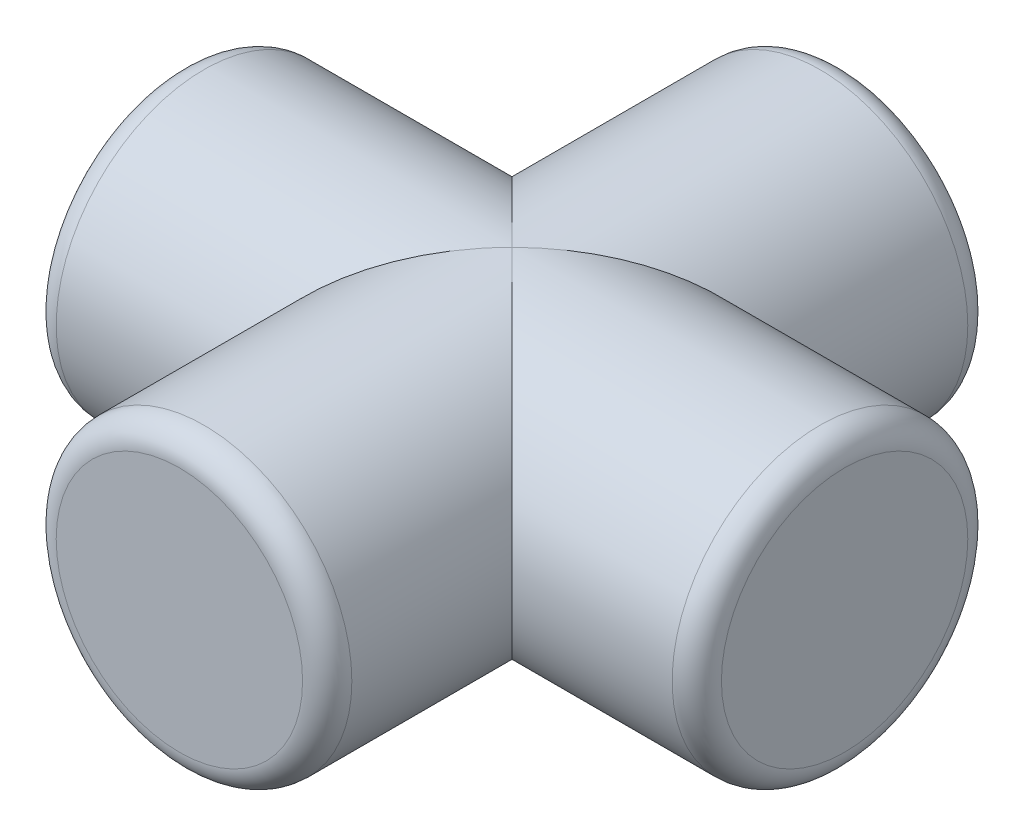
ISO-10303-21;
HEADER;
FILE_DESCRIPTION(('STEP AP214'),'2;1');
FILE_NAME('part.step','',(''),(''),'','','');
FILE_SCHEMA(('AUTOMOTIVE_DESIGN { 1 0 10303 214 1 1 1 1 }'));
ENDSEC;
DATA;
#1=APPLICATION_CONTEXT('core data for automotive mechanical design processes');
#2=APPLICATION_PROTOCOL_DEFINITION('international standard','automotive_design',2000,#1);
#3=PRODUCT_CONTEXT('',#1,'mechanical');
#4=PRODUCT('Part','Part','',(#3));
#5=PRODUCT_RELATED_PRODUCT_CATEGORY('part','',(#4));
#6=PRODUCT_DEFINITION_FORMATION('','',#4);
#7=PRODUCT_DEFINITION_CONTEXT('part definition',#1,'design');
#8=PRODUCT_DEFINITION('design','',#6,#7);
#9=PRODUCT_DEFINITION_SHAPE('','',#8);
#10=(LENGTH_UNIT() NAMED_UNIT(*) SI_UNIT(.MILLI.,.METRE.));
#11=(NAMED_UNIT(*) PLANE_ANGLE_UNIT() SI_UNIT($,.RADIAN.));
#12=(NAMED_UNIT(*) SI_UNIT($,.STERADIAN.) SOLID_ANGLE_UNIT());
#13=UNCERTAINTY_MEASURE_WITH_UNIT(LENGTH_MEASURE(1.E-05),#10,'distance_accuracy_value','');
#14=(GEOMETRIC_REPRESENTATION_CONTEXT(3) GLOBAL_UNCERTAINTY_ASSIGNED_CONTEXT((#13)) GLOBAL_UNIT_ASSIGNED_CONTEXT((#10,
#11,#12)) REPRESENTATION_CONTEXT('',''));
#15=CARTESIAN_POINT('',(0.,0.,0.));
#16=DIRECTION('',(0.,0.,1.));
#17=DIRECTION('',(1.,0.,0.));
#18=AXIS2_PLACEMENT_3D('',#15,#16,#17);
#19=CARTESIAN_POINT('',(0.,0.,34.29));
#20=DIRECTION('',(0.,0.,-1.));
#21=DIRECTION('',(-1.,0.,0.));
#22=AXIS2_PLACEMENT_3D('',#19,#20,#21);
#23=CYLINDRICAL_SURFACE('',#22,7.62);
#24=CARTESIAN_POINT('',(0.,0.,1.27));
#25=DIRECTION('',(0.,0.,1.));
#26=DIRECTION('',(1.,0.,0.));
#27=AXIS2_PLACEMENT_3D('',#24,#25,#26);
#28=CIRCLE('',#27,7.62);
#29=CARTESIAN_POINT('',(7.62,0.,1.27));
#30=VERTEX_POINT('',#29);
#31=EDGE_CURVE('E42',#30,#30,#28,.T.);
#32=ORIENTED_EDGE('',*,*,#31,.T.);
#33=EDGE_LOOP('',(#32));
#34=FACE_BOUND('',#33,.T.);
#35=CARTESIAN_POINT('',(0.,0.,17.145));
#36=DIRECTION('',(-0.707106781186547,0.,-0.707106781186547));
#37=DIRECTION('',(0.707106781186547,0.,-0.707106781186547));
#38=AXIS2_PLACEMENT_3D('',#35,#36,#37);
#39=ELLIPSE('',#38,10.776307345283,7.62);
#40=CARTESIAN_POINT('',(0.,7.62,17.145));
#41=VERTEX_POINT('',#40);
#42=CARTESIAN_POINT('',(0.,-7.62,17.145));
#43=VERTEX_POINT('',#42);
#44=EDGE_CURVE('E54',#41,#43,#39,.T.);
#45=ORIENTED_EDGE('',*,*,#44,.T.);
#46=CARTESIAN_POINT('',(0.,0.,17.145));
#47=DIRECTION('',(0.707106781186547,0.,-0.707106781186547));
#48=DIRECTION('',(-0.707106781186547,0.,-0.707106781186547));
#49=AXIS2_PLACEMENT_3D('',#46,#47,#48);
#50=ELLIPSE('',#49,10.776307345283,7.62);
#51=EDGE_CURVE('E59',#43,#41,#50,.T.);
#52=ORIENTED_EDGE('',*,*,#51,.T.);
#53=EDGE_LOOP('',(#45,#52));
#54=FACE_BOUND('',#53,.T.);
#55=ADVANCED_FACE('F34',(#34,#54),#23,.T.);
#56=CARTESIAN_POINT('',(0.,0.,0.));
#57=DIRECTION('',(0.,0.,1.));
#58=DIRECTION('',(1.,0.,0.));
#59=AXIS2_PLACEMENT_3D('',#56,#57,#58);
#60=PLANE('',#59);
#61=CARTESIAN_POINT('',(0.,0.,0.));
#62=DIRECTION('',(0.,0.,1.));
#63=DIRECTION('',(1.,0.,0.));
#64=AXIS2_PLACEMENT_3D('',#61,#62,#63);
#65=CIRCLE('',#64,6.35);
#66=CARTESIAN_POINT('',(6.35,0.,0.));
#67=VERTEX_POINT('',#66);
#68=EDGE_CURVE('E11',#67,#67,#65,.F.);
#69=ORIENTED_EDGE('',*,*,#68,.T.);
#70=EDGE_LOOP('',(#69));
#71=FACE_BOUND('',#70,.T.);
#72=ADVANCED_FACE('F99',(#71),#60,.F.);
#73=CARTESIAN_POINT('',(-17.145,0.,17.145));
#74=DIRECTION('',(1.,0.,0.));
#75=DIRECTION('',(0.,0.,-1.));
#76=AXIS2_PLACEMENT_3D('',#73,#74,#75);
#77=PLANE('',#76);
#78=CARTESIAN_POINT('',(-17.145,0.,17.145));
#79=DIRECTION('',(1.,0.,0.));
#80=DIRECTION('',(0.,0.,-1.));
#81=AXIS2_PLACEMENT_3D('',#78,#79,#80);
#82=CIRCLE('',#81,6.35);
#83=CARTESIAN_POINT('',(-17.145,0.,10.795));
#84=VERTEX_POINT('',#83);
#85=EDGE_CURVE('E83',#84,#84,#82,.F.);
#86=ORIENTED_EDGE('',*,*,#85,.T.);
#87=EDGE_LOOP('',(#86));
#88=FACE_BOUND('',#87,.T.);
#89=ADVANCED_FACE('F104',(#88),#77,.F.);
#90=CARTESIAN_POINT('',(-17.145,0.,17.145));
#91=DIRECTION('',(1.,0.,0.));
#92=DIRECTION('',(0.,0.,-1.));
#93=AXIS2_PLACEMENT_3D('',#90,#91,#92);
#94=CYLINDRICAL_SURFACE('',#93,7.62);
#95=CARTESIAN_POINT('',(-15.875,0.,17.145));
#96=DIRECTION('',(1.,0.,0.));
#97=DIRECTION('',(0.,0.,-1.));
#98=AXIS2_PLACEMENT_3D('',#95,#96,#97);
#99=CIRCLE('',#98,7.62);
#100=CARTESIAN_POINT('',(-15.875,0.,9.525));
#101=VERTEX_POINT('',#100);
#102=EDGE_CURVE('E80',#101,#101,#99,.T.);
#103=ORIENTED_EDGE('',*,*,#102,.T.);
#104=EDGE_LOOP('',(#103));
#105=FACE_BOUND('',#104,.T.);
#106=ORIENTED_EDGE('',*,*,#51,.F.);
#107=CARTESIAN_POINT('',(0.,0.,17.145));
#108=DIRECTION('',(-0.707106781186547,0.,-0.707106781186547));
#109=DIRECTION('',(0.707106781186547,0.,-0.707106781186547));
#110=AXIS2_PLACEMENT_3D('',#107,#108,#109);
#111=ELLIPSE('',#110,10.776307345283,7.62);
#112=EDGE_CURVE('E48',#41,#43,#111,.F.);
#113=ORIENTED_EDGE('',*,*,#112,.F.);
#114=EDGE_LOOP('',(#106,#113));
#115=FACE_BOUND('',#114,.T.);
#116=ADVANCED_FACE('F62',(#105,#115),#94,.T.);
#117=CARTESIAN_POINT('',(15.875,0.,17.145));
#118=DIRECTION('',(1.,0.,0.));
#119=DIRECTION('',(0.,0.,-1.));
#120=AXIS2_PLACEMENT_3D('',#117,#118,#119);
#121=CIRCLE('',#120,7.62);
#122=CARTESIAN_POINT('',(15.875,0.,9.525));
#123=VERTEX_POINT('',#122);
#124=EDGE_CURVE('E77',#123,#123,#121,.F.);
#125=ORIENTED_EDGE('',*,*,#124,.T.);
#126=EDGE_LOOP('',(#125));
#127=FACE_BOUND('',#126,.T.);
#128=CARTESIAN_POINT('',(0.,0.,17.145));
#129=DIRECTION('',(0.707106781186547,0.,-0.707106781186547));
#130=DIRECTION('',(-0.707106781186547,0.,-0.707106781186547));
#131=AXIS2_PLACEMENT_3D('',#128,#129,#130);
#132=ELLIPSE('',#131,10.776307345283,7.62);
#133=EDGE_CURVE('E56',#43,#41,#132,.F.);
#134=ORIENTED_EDGE('',*,*,#133,.F.);
#135=ORIENTED_EDGE('',*,*,#44,.F.);
#136=EDGE_LOOP('',(#134,#135));
#137=FACE_BOUND('',#136,.T.);
#138=ADVANCED_FACE('F55',(#127,#137),#94,.T.);
#139=CARTESIAN_POINT('',(17.145,0.,17.145));
#140=DIRECTION('',(1.,0.,0.));
#141=DIRECTION('',(0.,0.,-1.));
#142=AXIS2_PLACEMENT_3D('',#139,#140,#141);
#143=PLANE('',#142);
#144=CARTESIAN_POINT('',(17.145,0.,17.145));
#145=DIRECTION('',(1.,0.,0.));
#146=DIRECTION('',(0.,0.,-1.));
#147=AXIS2_PLACEMENT_3D('',#144,#145,#146);
#148=CIRCLE('',#147,6.35);
#149=CARTESIAN_POINT('',(17.145,0.,10.795));
#150=VERTEX_POINT('',#149);
#151=EDGE_CURVE('E74',#150,#150,#148,.T.);
#152=ORIENTED_EDGE('',*,*,#151,.T.);
#153=EDGE_LOOP('',(#152));
#154=FACE_BOUND('',#153,.T.);
#155=ADVANCED_FACE('F117',(#154),#143,.T.);
#156=CARTESIAN_POINT('',(0.,0.,34.29));
#157=DIRECTION('',(0.,0.,1.));
#158=DIRECTION('',(1.,0.,0.));
#159=AXIS2_PLACEMENT_3D('',#156,#157,#158);
#160=PLANE('',#159);
#161=CARTESIAN_POINT('',(0.,0.,34.29));
#162=DIRECTION('',(0.,0.,1.));
#163=DIRECTION('',(1.,0.,0.));
#164=AXIS2_PLACEMENT_3D('',#161,#162,#163);
#165=CIRCLE('',#164,6.35);
#166=CARTESIAN_POINT('',(6.35,0.,34.29));
#167=VERTEX_POINT('',#166);
#168=EDGE_CURVE('E65',#167,#167,#165,.T.);
#169=ORIENTED_EDGE('',*,*,#168,.T.);
#170=EDGE_LOOP('',(#169));
#171=FACE_BOUND('',#170,.T.);
#172=ADVANCED_FACE('F110',(#171),#160,.T.);
#173=CARTESIAN_POINT('',(0.,0.,33.02));
#174=DIRECTION('',(0.,0.,1.));
#175=DIRECTION('',(1.,0.,0.));
#176=AXIS2_PLACEMENT_3D('',#173,#174,#175);
#177=CIRCLE('',#176,7.62);
#178=CARTESIAN_POINT('',(7.62,0.,33.02));
#179=VERTEX_POINT('',#178);
#180=EDGE_CURVE('E71',#179,#179,#177,.F.);
#181=ORIENTED_EDGE('',*,*,#180,.T.);
#182=EDGE_LOOP('',(#181));
#183=FACE_BOUND('',#182,.T.);
#184=ORIENTED_EDGE('',*,*,#112,.T.);
#185=ORIENTED_EDGE('',*,*,#133,.T.);
#186=EDGE_LOOP('',(#184,#185));
#187=FACE_BOUND('',#186,.T.);
#188=ADVANCED_FACE('F64',(#183,#187),#23,.T.);
#189=CARTESIAN_POINT('',(0.,0.,33.02));
#190=DIRECTION('',(0.,0.,1.));
#191=DIRECTION('',(1.,0.,0.));
#192=AXIS2_PLACEMENT_3D('',#189,#190,#191);
#193=TOROIDAL_SURFACE('',#192,6.35,1.27);
#194=ORIENTED_EDGE('',*,*,#180,.F.);
#195=EDGE_LOOP('',(#194));
#196=FACE_BOUND('',#195,.T.);
#197=ORIENTED_EDGE('',*,*,#168,.F.);
#198=EDGE_LOOP('',(#197));
#199=FACE_BOUND('',#198,.T.);
#200=ADVANCED_FACE('F109',(#196,#199),#193,.T.);
#201=CARTESIAN_POINT('',(15.875,0.,17.145));
#202=DIRECTION('',(1.,0.,0.));
#203=DIRECTION('',(0.,0.,-1.));
#204=AXIS2_PLACEMENT_3D('',#201,#202,#203);
#205=TOROIDAL_SURFACE('',#204,6.35,1.27);
#206=ORIENTED_EDGE('',*,*,#124,.F.);
#207=EDGE_LOOP('',(#206));
#208=FACE_BOUND('',#207,.T.);
#209=ORIENTED_EDGE('',*,*,#151,.F.);
#210=EDGE_LOOP('',(#209));
#211=FACE_BOUND('',#210,.T.);
#212=ADVANCED_FACE('F95',(#208,#211),#205,.T.);
#213=CARTESIAN_POINT('',(-15.875,0.,17.145));
#214=DIRECTION('',(1.,0.,0.));
#215=DIRECTION('',(0.,0.,-1.));
#216=AXIS2_PLACEMENT_3D('',#213,#214,#215);
#217=TOROIDAL_SURFACE('',#216,6.35,1.27);
#218=ORIENTED_EDGE('',*,*,#85,.F.);
#219=EDGE_LOOP('',(#218));
#220=FACE_BOUND('',#219,.T.);
#221=ORIENTED_EDGE('',*,*,#102,.F.);
#222=EDGE_LOOP('',(#221));
#223=FACE_BOUND('',#222,.T.);
#224=ADVANCED_FACE('F90',(#220,#223),#217,.T.);
#225=CARTESIAN_POINT('',(0.,0.,1.27));
#226=DIRECTION('',(0.,0.,1.));
#227=DIRECTION('',(1.,0.,0.));
#228=AXIS2_PLACEMENT_3D('',#225,#226,#227);
#229=TOROIDAL_SURFACE('',#228,6.35,1.27);
#230=ORIENTED_EDGE('',*,*,#68,.F.);
#231=EDGE_LOOP('',(#230));
#232=FACE_BOUND('',#231,.T.);
#233=ORIENTED_EDGE('',*,*,#31,.F.);
#234=EDGE_LOOP('',(#233));
#235=FACE_BOUND('',#234,.T.);
#236=ADVANCED_FACE('F36',(#232,#235),#229,.T.);
#237=CLOSED_SHELL('',(#55,#72,#89,#116,#138,#155,#172,#188,#200,#212,#224,#236));
#238=MANIFOLD_SOLID_BREP('B2',#237);
#239=ADVANCED_BREP_SHAPE_REPRESENTATION('',(#18,#238),#14);
#240=SHAPE_DEFINITION_REPRESENTATION(#9,#239);
ENDSEC;
END-ISO-10303-21;
